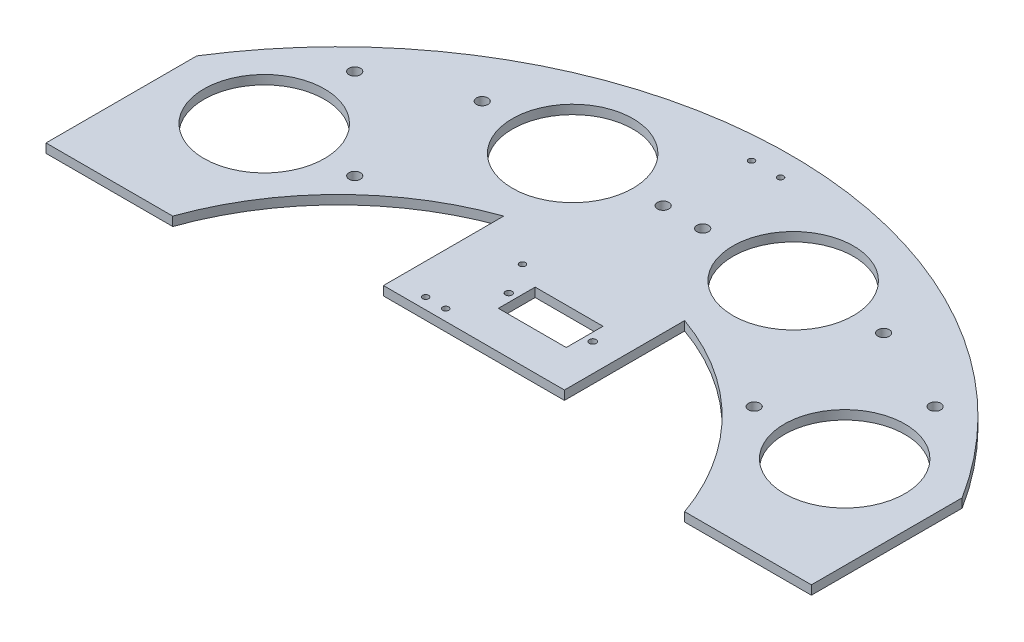
ISO-10303-21;
HEADER;
FILE_DESCRIPTION(('STEP AP214'),'2;1');
FILE_NAME('part.step','',(''),(''),'','','');
FILE_SCHEMA(('AUTOMOTIVE_DESIGN { 1 0 10303 214 1 1 1 1 }'));
ENDSEC;
DATA;
#1=APPLICATION_CONTEXT('core data for automotive mechanical design processes');
#2=APPLICATION_PROTOCOL_DEFINITION('international standard','automotive_design',2000,#1);
#3=PRODUCT_CONTEXT('',#1,'mechanical');
#4=PRODUCT('Part','Part','',(#3));
#5=PRODUCT_RELATED_PRODUCT_CATEGORY('part','',(#4));
#6=PRODUCT_DEFINITION_FORMATION('','',#4);
#7=PRODUCT_DEFINITION_CONTEXT('part definition',#1,'design');
#8=PRODUCT_DEFINITION('design','',#6,#7);
#9=PRODUCT_DEFINITION_SHAPE('','',#8);
#10=(LENGTH_UNIT() NAMED_UNIT(*) SI_UNIT(.MILLI.,.METRE.));
#11=(NAMED_UNIT(*) PLANE_ANGLE_UNIT() SI_UNIT($,.RADIAN.));
#12=(NAMED_UNIT(*) SI_UNIT($,.STERADIAN.) SOLID_ANGLE_UNIT());
#13=UNCERTAINTY_MEASURE_WITH_UNIT(LENGTH_MEASURE(1.E-05),#10,'distance_accuracy_value','');
#14=(GEOMETRIC_REPRESENTATION_CONTEXT(3) GLOBAL_UNCERTAINTY_ASSIGNED_CONTEXT((#13)) GLOBAL_UNIT_ASSIGNED_CONTEXT((#10,
#11,#12)) REPRESENTATION_CONTEXT('',''));
#15=CARTESIAN_POINT('',(0.,0.,0.));
#16=DIRECTION('',(0.,0.,1.));
#17=DIRECTION('',(1.,0.,0.));
#18=AXIS2_PLACEMENT_3D('',#15,#16,#17);
#19=CARTESIAN_POINT('',(126.885775404495,3.,0.));
#20=DIRECTION('',(-1.,0.,0.));
#21=DIRECTION('',(0.,0.,1.));
#22=AXIS2_PLACEMENT_3D('',#19,#20,#21);
#23=PLANE('',#22);
#24=DIRECTION('',(0.,0.,-1.));
#25=VECTOR('',#24,1.);
#26=CARTESIAN_POINT('',(126.885775404495,0.,0.));
#27=LINE('',#26,#25);
#28=CARTESIAN_POINT('',(126.885775404495,0.,16.7898324885886));
#29=VERTEX_POINT('',#28);
#30=CARTESIAN_POINT('',(126.885775404495,0.,-33.2101675114114));
#31=VERTEX_POINT('',#30);
#32=EDGE_CURVE('E274',#29,#31,#27,.T.);
#33=ORIENTED_EDGE('',*,*,#32,.T.);
#34=DIRECTION('',(0.,-1.,0.));
#35=VECTOR('',#34,1.);
#36=CARTESIAN_POINT('',(126.885775404495,3.,-33.2101675114114));
#37=LINE('',#36,#35);
#38=CARTESIAN_POINT('',(126.885775404495,3.,-33.2101675114114));
#39=VERTEX_POINT('',#38);
#40=EDGE_CURVE('E11',#39,#31,#37,.T.);
#41=ORIENTED_EDGE('',*,*,#40,.F.);
#42=DIRECTION('',(0.,0.,-1.));
#43=VECTOR('',#42,1.);
#44=CARTESIAN_POINT('',(126.885775404495,3.,0.));
#45=LINE('',#44,#43);
#46=CARTESIAN_POINT('',(126.885775404495,3.,16.7898324885886));
#47=VERTEX_POINT('',#46);
#48=EDGE_CURVE('E239',#47,#39,#45,.T.);
#49=ORIENTED_EDGE('',*,*,#48,.F.);
#50=DIRECTION('',(0.,-1.,0.));
#51=VECTOR('',#50,1.);
#52=CARTESIAN_POINT('',(126.885775404495,3.,16.7898324885886));
#53=LINE('',#52,#51);
#54=EDGE_CURVE('E262',#47,#29,#53,.T.);
#55=ORIENTED_EDGE('',*,*,#54,.T.);
#56=EDGE_LOOP('',(#33,#41,#49,#55));
#57=FACE_BOUND('',#56,.T.);
#58=ADVANCED_FACE('F39',(#57),#23,.F.);
#59=CARTESIAN_POINT('',(0.,3.,46.7898324885886));
#60=DIRECTION('',(0.,-1.,0.));
#61=DIRECTION('',(0.,0.,-1.));
#62=AXIS2_PLACEMENT_3D('',#59,#60,#61);
#63=CYLINDRICAL_SURFACE('',#62,150.);
#64=CARTESIAN_POINT('',(0.,0.,46.7898324885886));
#65=DIRECTION('',(0.,1.,0.));
#66=DIRECTION('',(0.,0.,1.));
#67=AXIS2_PLACEMENT_3D('',#64,#65,#66);
#68=CIRCLE('',#67,150.);
#69=CARTESIAN_POINT('',(-126.885775404495,0.,-33.2101675114114));
#70=VERTEX_POINT('',#69);
#71=EDGE_CURVE('E277',#31,#70,#68,.T.);
#72=ORIENTED_EDGE('',*,*,#71,.T.);
#73=DIRECTION('',(0.,-1.,0.));
#74=VECTOR('',#73,1.);
#75=CARTESIAN_POINT('',(-126.885775404495,3.,-33.2101675114114));
#76=LINE('',#75,#74);
#77=CARTESIAN_POINT('',(-126.885775404495,3.,-33.2101675114114));
#78=VERTEX_POINT('',#77);
#79=EDGE_CURVE('E47',#78,#70,#76,.T.);
#80=ORIENTED_EDGE('',*,*,#79,.F.);
#81=CARTESIAN_POINT('',(0.,3.,46.7898324885886));
#82=DIRECTION('',(0.,1.,0.));
#83=DIRECTION('',(0.,0.,1.));
#84=AXIS2_PLACEMENT_3D('',#81,#82,#83);
#85=CIRCLE('',#84,150.);
#86=EDGE_CURVE('E242',#39,#78,#85,.T.);
#87=ORIENTED_EDGE('',*,*,#86,.F.);
#88=ORIENTED_EDGE('',*,*,#40,.T.);
#89=EDGE_LOOP('',(#72,#80,#87,#88));
#90=FACE_BOUND('',#89,.T.);
#91=ADVANCED_FACE('F321',(#90),#63,.T.);
#92=CARTESIAN_POINT('',(-126.885775404495,3.,0.));
#93=DIRECTION('',(-1.,0.,0.));
#94=DIRECTION('',(0.,0.,1.));
#95=AXIS2_PLACEMENT_3D('',#92,#93,#94);
#96=PLANE('',#95);
#97=DIRECTION('',(0.,0.,-1.));
#98=VECTOR('',#97,1.);
#99=CARTESIAN_POINT('',(-126.885775404495,0.,0.));
#100=LINE('',#99,#98);
#101=CARTESIAN_POINT('',(-126.885775404495,0.,16.7898324885886));
#102=VERTEX_POINT('',#101);
#103=EDGE_CURVE('E280',#102,#70,#100,.T.);
#104=ORIENTED_EDGE('',*,*,#103,.F.);
#105=DIRECTION('',(0.,-1.,0.));
#106=VECTOR('',#105,1.);
#107=CARTESIAN_POINT('',(-126.885775404495,3.,16.7898324885886));
#108=LINE('',#107,#106);
#109=CARTESIAN_POINT('',(-126.885775404495,3.,16.7898324885886));
#110=VERTEX_POINT('',#109);
#111=EDGE_CURVE('E314',#110,#102,#108,.T.);
#112=ORIENTED_EDGE('',*,*,#111,.F.);
#113=DIRECTION('',(0.,0.,-1.));
#114=VECTOR('',#113,1.);
#115=CARTESIAN_POINT('',(-126.885775404495,3.,0.));
#116=LINE('',#115,#114);
#117=EDGE_CURVE('E244',#110,#78,#116,.T.);
#118=ORIENTED_EDGE('',*,*,#117,.T.);
#119=ORIENTED_EDGE('',*,*,#79,.T.);
#120=EDGE_LOOP('',(#104,#112,#118,#119));
#121=FACE_BOUND('',#120,.T.);
#122=ADVANCED_FACE('F318',(#121),#96,.T.);
#123=CARTESIAN_POINT('',(0.,3.,16.7898324885886));
#124=DIRECTION('',(0.,0.,-1.));
#125=DIRECTION('',(-1.,0.,0.));
#126=AXIS2_PLACEMENT_3D('',#123,#124,#125);
#127=PLANE('',#126);
#128=DIRECTION('',(1.,0.,0.));
#129=VECTOR('',#128,1.);
#130=CARTESIAN_POINT('',(0.,0.,16.7898324885886));
#131=LINE('',#130,#129);
#132=CARTESIAN_POINT('',(-84.8716884499019,0.,16.7898324885886));
#133=VERTEX_POINT('',#132);
#134=EDGE_CURVE('E283',#102,#133,#131,.T.);
#135=ORIENTED_EDGE('',*,*,#134,.T.);
#136=DIRECTION('',(0.,-1.,0.));
#137=VECTOR('',#136,1.);
#138=CARTESIAN_POINT('',(-84.8716884499019,3.,16.7898324885886));
#139=LINE('',#138,#137);
#140=CARTESIAN_POINT('',(-84.8716884499019,3.,16.7898324885886));
#141=VERTEX_POINT('',#140);
#142=EDGE_CURVE('E312',#141,#133,#139,.T.);
#143=ORIENTED_EDGE('',*,*,#142,.F.);
#144=DIRECTION('',(1.,0.,0.));
#145=VECTOR('',#144,1.);
#146=CARTESIAN_POINT('',(0.,3.,16.7898324885886));
#147=LINE('',#146,#145);
#148=EDGE_CURVE('E247',#110,#141,#147,.T.);
#149=ORIENTED_EDGE('',*,*,#148,.F.);
#150=ORIENTED_EDGE('',*,*,#111,.T.);
#151=EDGE_LOOP('',(#135,#143,#149,#150));
#152=FACE_BOUND('',#151,.T.);
#153=ADVANCED_FACE('F330',(#152),#127,.F.);
#154=CARTESIAN_POINT('',(0.,3.,46.7898324885886));
#155=DIRECTION('',(0.,-1.,0.));
#156=DIRECTION('',(0.,0.,-1.));
#157=AXIS2_PLACEMENT_3D('',#154,#155,#156);
#158=CYLINDRICAL_SURFACE('',#157,90.0177954647702);
#159=CARTESIAN_POINT('',(0.,0.,46.7898324885886));
#160=DIRECTION('',(0.,1.,0.));
#161=DIRECTION('',(0.,0.,1.));
#162=AXIS2_PLACEMENT_3D('',#159,#160,#161);
#163=CIRCLE('',#162,90.0177954647702);
#164=CARTESIAN_POINT('',(-30.,0.,-38.0818559613133));
#165=VERTEX_POINT('',#164);
#166=EDGE_CURVE('E286',#165,#133,#163,.T.);
#167=ORIENTED_EDGE('',*,*,#166,.F.);
#168=DIRECTION('',(0.,-1.,0.));
#169=VECTOR('',#168,1.);
#170=CARTESIAN_POINT('',(-30.,3.,-38.0818559613133));
#171=LINE('',#170,#169);
#172=CARTESIAN_POINT('',(-30.,3.,-38.0818559613133));
#173=VERTEX_POINT('',#172);
#174=EDGE_CURVE('E310',#173,#165,#171,.T.);
#175=ORIENTED_EDGE('',*,*,#174,.F.);
#176=CARTESIAN_POINT('',(0.,3.,46.7898324885886));
#177=DIRECTION('',(0.,1.,0.));
#178=DIRECTION('',(0.,0.,1.));
#179=AXIS2_PLACEMENT_3D('',#176,#177,#178);
#180=CIRCLE('',#179,90.0177954647702);
#181=EDGE_CURVE('E249',#173,#141,#180,.T.);
#182=ORIENTED_EDGE('',*,*,#181,.T.);
#183=ORIENTED_EDGE('',*,*,#142,.T.);
#184=EDGE_LOOP('',(#167,#175,#182,#183));
#185=FACE_BOUND('',#184,.T.);
#186=ADVANCED_FACE('F360',(#185),#158,.F.);
#187=CARTESIAN_POINT('',(-30.,3.,0.));
#188=DIRECTION('',(-1.,0.,0.));
#189=DIRECTION('',(0.,0.,1.));
#190=AXIS2_PLACEMENT_3D('',#187,#188,#189);
#191=PLANE('',#190);
#192=DIRECTION('',(0.,0.,-1.));
#193=VECTOR('',#192,1.);
#194=CARTESIAN_POINT('',(-30.,0.,0.));
#195=LINE('',#194,#193);
#196=CARTESIAN_POINT('',(-30.,0.,1.78983248858858));
#197=VERTEX_POINT('',#196);
#198=EDGE_CURVE('E289',#197,#165,#195,.T.);
#199=ORIENTED_EDGE('',*,*,#198,.F.);
#200=DIRECTION('',(0.,-1.,0.));
#201=VECTOR('',#200,1.);
#202=CARTESIAN_POINT('',(-30.,3.,1.78983248858858));
#203=LINE('',#202,#201);
#204=CARTESIAN_POINT('',(-30.,3.,1.78983248858858));
#205=VERTEX_POINT('',#204);
#206=EDGE_CURVE('E308',#205,#197,#203,.T.);
#207=ORIENTED_EDGE('',*,*,#206,.F.);
#208=DIRECTION('',(0.,0.,-1.));
#209=VECTOR('',#208,1.);
#210=CARTESIAN_POINT('',(-30.,3.,0.));
#211=LINE('',#210,#209);
#212=EDGE_CURVE('E252',#205,#173,#211,.T.);
#213=ORIENTED_EDGE('',*,*,#212,.T.);
#214=ORIENTED_EDGE('',*,*,#174,.T.);
#215=EDGE_LOOP('',(#199,#207,#213,#214));
#216=FACE_BOUND('',#215,.T.);
#217=ADVANCED_FACE('F356',(#216),#191,.T.);
#218=CARTESIAN_POINT('',(0.,3.,1.78983248858857));
#219=DIRECTION('',(0.,0.,-1.));
#220=DIRECTION('',(-1.,0.,0.));
#221=AXIS2_PLACEMENT_3D('',#218,#219,#220);
#222=PLANE('',#221);
#223=DIRECTION('',(1.,0.,0.));
#224=VECTOR('',#223,1.);
#225=CARTESIAN_POINT('',(0.,0.,1.78983248858857));
#226=LINE('',#225,#224);
#227=CARTESIAN_POINT('',(30.,0.,1.78983248858857));
#228=VERTEX_POINT('',#227);
#229=EDGE_CURVE('E293',#197,#228,#226,.T.);
#230=ORIENTED_EDGE('',*,*,#229,.T.);
#231=DIRECTION('',(0.,-1.,0.));
#232=VECTOR('',#231,1.);
#233=CARTESIAN_POINT('',(30.,3.,1.78983248858857));
#234=LINE('',#233,#232);
#235=CARTESIAN_POINT('',(30.,3.,1.78983248858857));
#236=VERTEX_POINT('',#235);
#237=EDGE_CURVE('E305',#236,#228,#234,.T.);
#238=ORIENTED_EDGE('',*,*,#237,.F.);
#239=DIRECTION('',(1.,0.,0.));
#240=VECTOR('',#239,1.);
#241=CARTESIAN_POINT('',(0.,3.,1.78983248858857));
#242=LINE('',#241,#240);
#243=EDGE_CURVE('E256',#205,#236,#242,.T.);
#244=ORIENTED_EDGE('',*,*,#243,.F.);
#245=ORIENTED_EDGE('',*,*,#206,.T.);
#246=EDGE_LOOP('',(#230,#238,#244,#245));
#247=FACE_BOUND('',#246,.T.);
#248=ADVANCED_FACE('F361',(#247),#222,.F.);
#249=CARTESIAN_POINT('',(30.,3.,0.));
#250=DIRECTION('',(-1.,0.,0.));
#251=DIRECTION('',(0.,0.,1.));
#252=AXIS2_PLACEMENT_3D('',#249,#250,#251);
#253=PLANE('',#252);
#254=DIRECTION('',(0.,0.,-1.));
#255=VECTOR('',#254,1.);
#256=CARTESIAN_POINT('',(30.,0.,0.));
#257=LINE('',#256,#255);
#258=CARTESIAN_POINT('',(30.,0.,-38.0818559613133));
#259=VERTEX_POINT('',#258);
#260=EDGE_CURVE('E295',#228,#259,#257,.T.);
#261=ORIENTED_EDGE('',*,*,#260,.T.);
#262=DIRECTION('',(0.,-1.,0.));
#263=VECTOR('',#262,1.);
#264=CARTESIAN_POINT('',(30.,3.,-38.0818559613133));
#265=LINE('',#264,#263);
#266=CARTESIAN_POINT('',(30.,3.,-38.0818559613133));
#267=VERTEX_POINT('',#266);
#268=EDGE_CURVE('E303',#267,#259,#265,.T.);
#269=ORIENTED_EDGE('',*,*,#268,.F.);
#270=DIRECTION('',(0.,0.,-1.));
#271=VECTOR('',#270,1.);
#272=CARTESIAN_POINT('',(30.,3.,0.));
#273=LINE('',#272,#271);
#274=EDGE_CURVE('E258',#236,#267,#273,.T.);
#275=ORIENTED_EDGE('',*,*,#274,.F.);
#276=ORIENTED_EDGE('',*,*,#237,.T.);
#277=EDGE_LOOP('',(#261,#269,#275,#276));
#278=FACE_BOUND('',#277,.T.);
#279=ADVANCED_FACE('F350',(#278),#253,.F.);
#280=CARTESIAN_POINT('',(84.8716884499019,0.,16.7898324885886));
#281=VERTEX_POINT('',#280);
#282=EDGE_CURVE('E290',#281,#259,#163,.T.);
#283=ORIENTED_EDGE('',*,*,#282,.F.);
#284=DIRECTION('',(0.,-1.,0.));
#285=VECTOR('',#284,1.);
#286=CARTESIAN_POINT('',(84.8716884499019,3.,16.7898324885886));
#287=LINE('',#286,#285);
#288=CARTESIAN_POINT('',(84.8716884499019,3.,16.7898324885886));
#289=VERTEX_POINT('',#288);
#290=EDGE_CURVE('E301',#289,#281,#287,.T.);
#291=ORIENTED_EDGE('',*,*,#290,.F.);
#292=EDGE_CURVE('E253',#289,#267,#180,.T.);
#293=ORIENTED_EDGE('',*,*,#292,.T.);
#294=ORIENTED_EDGE('',*,*,#268,.T.);
#295=EDGE_LOOP('',(#283,#291,#293,#294));
#296=FACE_BOUND('',#295,.T.);
#297=ADVANCED_FACE('F345',(#296),#158,.F.);
#298=CARTESIAN_POINT('',(36.5556268754658,3.,-67.5066510257423));
#299=DIRECTION('',(0.,-1.,0.));
#300=DIRECTION('',(0.,0.,-1.));
#301=AXIS2_PLACEMENT_3D('',#298,#299,#300);
#302=CYLINDRICAL_SURFACE('',#301,20.);
#303=CARTESIAN_POINT('',(36.5556268754658,3.,-67.5066510257423));
#304=DIRECTION('',(0.,1.,0.));
#305=DIRECTION('',(0.,0.,1.));
#306=AXIS2_PLACEMENT_3D('',#303,#304,#305);
#307=CIRCLE('',#306,20.);
#308=CARTESIAN_POINT('',(36.5556268754658,3.,-47.5066510257423));
#309=VERTEX_POINT('',#308);
#310=EDGE_CURVE('E236',#309,#309,#307,.F.);
#311=ORIENTED_EDGE('',*,*,#310,.F.);
#312=EDGE_LOOP('',(#311));
#313=FACE_BOUND('',#312,.T.);
#314=CARTESIAN_POINT('',(36.5556268754658,0.,-67.5066510257423));
#315=DIRECTION('',(0.,1.,0.));
#316=DIRECTION('',(0.,0.,1.));
#317=AXIS2_PLACEMENT_3D('',#314,#315,#316);
#318=CIRCLE('',#317,20.);
#319=CARTESIAN_POINT('',(36.5556268754658,0.,-47.5066510257423));
#320=VERTEX_POINT('',#319);
#321=EDGE_CURVE('E271',#320,#320,#318,.F.);
#322=ORIENTED_EDGE('',*,*,#321,.T.);
#323=EDGE_LOOP('',(#322));
#324=FACE_BOUND('',#323,.T.);
#325=ADVANCED_FACE('F378',(#313,#324),#302,.F.);
#326=CARTESIAN_POINT('',(-96.2238553059831,3.,-24.9107230884307));
#327=DIRECTION('',(0.,-1.,0.));
#328=DIRECTION('',(0.,0.,-1.));
#329=AXIS2_PLACEMENT_3D('',#326,#327,#328);
#330=CYLINDRICAL_SURFACE('',#329,20.);
#331=CARTESIAN_POINT('',(-96.2238553059831,3.,-24.9107230884307));
#332=DIRECTION('',(0.,1.,0.));
#333=DIRECTION('',(0.,0.,1.));
#334=AXIS2_PLACEMENT_3D('',#331,#332,#333);
#335=CIRCLE('',#334,20.);
#336=CARTESIAN_POINT('',(-96.2238553059831,3.,-4.91072308843064));
#337=VERTEX_POINT('',#336);
#338=EDGE_CURVE('E233',#337,#337,#335,.T.);
#339=ORIENTED_EDGE('',*,*,#338,.T.);
#340=EDGE_LOOP('',(#339));
#341=FACE_BOUND('',#340,.T.);
#342=CARTESIAN_POINT('',(-96.2238553059831,0.,-24.9107230884307));
#343=DIRECTION('',(0.,1.,0.));
#344=DIRECTION('',(0.,0.,1.));
#345=AXIS2_PLACEMENT_3D('',#342,#343,#344);
#346=CIRCLE('',#345,20.);
#347=CARTESIAN_POINT('',(-96.2238553059831,0.,-4.91072308843064));
#348=VERTEX_POINT('',#347);
#349=EDGE_CURVE('E268',#348,#348,#346,.T.);
#350=ORIENTED_EDGE('',*,*,#349,.F.);
#351=EDGE_LOOP('',(#350));
#352=FACE_BOUND('',#351,.T.);
#353=ADVANCED_FACE('F381',(#341,#352),#330,.F.);
#354=CARTESIAN_POINT('',(-36.5556268754658,3.,-67.5066510257423));
#355=DIRECTION('',(0.,-1.,0.));
#356=DIRECTION('',(0.,0.,-1.));
#357=AXIS2_PLACEMENT_3D('',#354,#355,#356);
#358=CYLINDRICAL_SURFACE('',#357,20.);
#359=CARTESIAN_POINT('',(-36.5556268754658,3.,-67.5066510257423));
#360=DIRECTION('',(0.,1.,0.));
#361=DIRECTION('',(0.,0.,1.));
#362=AXIS2_PLACEMENT_3D('',#359,#360,#361);
#363=CIRCLE('',#362,20.);
#364=CARTESIAN_POINT('',(-36.5556268754658,3.,-47.5066510257423));
#365=VERTEX_POINT('',#364);
#366=EDGE_CURVE('E229',#365,#365,#363,.T.);
#367=ORIENTED_EDGE('',*,*,#366,.T.);
#368=EDGE_LOOP('',(#367));
#369=FACE_BOUND('',#368,.T.);
#370=CARTESIAN_POINT('',(-36.5556268754658,0.,-67.5066510257423));
#371=DIRECTION('',(0.,1.,0.));
#372=DIRECTION('',(0.,0.,1.));
#373=AXIS2_PLACEMENT_3D('',#370,#371,#372);
#374=CIRCLE('',#373,20.);
#375=CARTESIAN_POINT('',(-36.5556268754658,0.,-47.5066510257423));
#376=VERTEX_POINT('',#375);
#377=EDGE_CURVE('E265',#376,#376,#374,.T.);
#378=ORIENTED_EDGE('',*,*,#377,.F.);
#379=EDGE_LOOP('',(#378));
#380=FACE_BOUND('',#379,.T.);
#381=ADVANCED_FACE('F384',(#369,#380),#358,.F.);
#382=CARTESIAN_POINT('',(96.2238553059831,3.,-24.9107230884307));
#383=DIRECTION('',(0.,-1.,0.));
#384=DIRECTION('',(0.,0.,-1.));
#385=AXIS2_PLACEMENT_3D('',#382,#383,#384);
#386=CYLINDRICAL_SURFACE('',#385,20.);
#387=CARTESIAN_POINT('',(96.2238553059831,3.,-24.9107230884307));
#388=DIRECTION('',(0.,1.,0.));
#389=DIRECTION('',(0.,0.,1.));
#390=AXIS2_PLACEMENT_3D('',#387,#388,#389);
#391=CIRCLE('',#390,20.);
#392=CARTESIAN_POINT('',(96.2238553059831,3.,-4.91072308843069));
#393=VERTEX_POINT('',#392);
#394=EDGE_CURVE('E226',#393,#393,#391,.F.);
#395=ORIENTED_EDGE('',*,*,#394,.F.);
#396=EDGE_LOOP('',(#395));
#397=FACE_BOUND('',#396,.T.);
#398=CARTESIAN_POINT('',(96.2238553059831,0.,-24.9107230884307));
#399=DIRECTION('',(0.,1.,0.));
#400=DIRECTION('',(0.,0.,1.));
#401=AXIS2_PLACEMENT_3D('',#398,#399,#400);
#402=CIRCLE('',#401,20.);
#403=CARTESIAN_POINT('',(96.2238553059831,0.,-4.91072308843069));
#404=VERTEX_POINT('',#403);
#405=EDGE_CURVE('E225',#404,#404,#402,.F.);
#406=ORIENTED_EDGE('',*,*,#405,.T.);
#407=EDGE_LOOP('',(#406));
#408=FACE_BOUND('',#407,.T.);
#409=ADVANCED_FACE('F41',(#397,#408),#386,.F.);
#410=CARTESIAN_POINT('',(0.,3.,16.7898324885886));
#411=DIRECTION('',(0.,0.,-1.));
#412=DIRECTION('',(-1.,0.,0.));
#413=AXIS2_PLACEMENT_3D('',#410,#411,#412);
#414=PLANE('',#413);
#415=DIRECTION('',(1.,0.,0.));
#416=VECTOR('',#415,1.);
#417=CARTESIAN_POINT('',(0.,0.,16.7898324885886));
#418=LINE('',#417,#416);
#419=EDGE_CURVE('E230',#281,#29,#418,.T.);
#420=ORIENTED_EDGE('',*,*,#419,.T.);
#421=ORIENTED_EDGE('',*,*,#54,.F.);
#422=DIRECTION('',(1.,0.,0.));
#423=VECTOR('',#422,1.);
#424=CARTESIAN_POINT('',(0.,3.,16.7898324885886));
#425=LINE('',#424,#423);
#426=EDGE_CURVE('E260',#289,#47,#425,.T.);
#427=ORIENTED_EDGE('',*,*,#426,.F.);
#428=ORIENTED_EDGE('',*,*,#290,.T.);
#429=EDGE_LOOP('',(#420,#421,#427,#428));
#430=FACE_BOUND('',#429,.T.);
#431=ADVANCED_FACE('F391',(#430),#414,.F.);
#432=CARTESIAN_POINT('',(0.,3.,0.));
#433=DIRECTION('',(0.,1.,0.));
#434=DIRECTION('',(0.,0.,1.));
#435=AXIS2_PLACEMENT_3D('',#432,#433,#434);
#436=PLANE('',#435);
#437=CARTESIAN_POINT('',(-19.7020798031692,3.,-1.91072308843045));
#438=DIRECTION('',(0.,-1.,0.));
#439=DIRECTION('',(0.,0.,-1.));
#440=AXIS2_PLACEMENT_3D('',#437,#438,#439);
#441=CIRCLE('',#440,1.);
#442=CARTESIAN_POINT('',(-19.7020798031692,3.,-2.91072308843045));
#443=VERTEX_POINT('',#442);
#444=EDGE_CURVE('E723',#443,#443,#441,.T.);
#445=ORIENTED_EDGE('',*,*,#444,.T.);
#446=EDGE_LOOP('',(#445));
#447=FACE_BOUND('',#446,.T.);
#448=CARTESIAN_POINT('',(-13.0536928846308,3.,-27.360397158154));
#449=DIRECTION('',(0.,-1.,0.));
#450=DIRECTION('',(0.,0.,-1.));
#451=AXIS2_PLACEMENT_3D('',#448,#449,#450);
#452=CIRCLE('',#451,1.);
#453=CARTESIAN_POINT('',(-13.0536928846308,3.,-28.360397158154));
#454=VERTEX_POINT('',#453);
#455=EDGE_CURVE('E726',#454,#454,#452,.T.);
#456=ORIENTED_EDGE('',*,*,#455,.T.);
#457=EDGE_LOOP('',(#456));
#458=FACE_BOUND('',#457,.T.);
#459=CARTESIAN_POINT('',(-4.80495675321821,3.,-95.0640967364949));
#460=DIRECTION('',(0.,-1.,0.));
#461=DIRECTION('',(0.,0.,-1.));
#462=AXIS2_PLACEMENT_3D('',#459,#460,#461);
#463=CIRCLE('',#462,1.);
#464=CARTESIAN_POINT('',(-4.80495675321821,3.,-96.0640967364949));
#465=VERTEX_POINT('',#464);
#466=EDGE_CURVE('E737',#465,#465,#463,.T.);
#467=ORIENTED_EDGE('',*,*,#466,.T.);
#468=EDGE_LOOP('',(#467));
#469=FACE_BOUND('',#468,.T.);
#470=CARTESIAN_POINT('',(4.804956753218,3.,-95.0640967364949));
#471=DIRECTION('',(0.,-1.,0.));
#472=DIRECTION('',(0.,0.,-1.));
#473=AXIS2_PLACEMENT_3D('',#470,#471,#472);
#474=CIRCLE('',#473,1.);
#475=CARTESIAN_POINT('',(4.804956753218,3.,-96.0640967364949));
#476=VERTEX_POINT('',#475);
#477=EDGE_CURVE('E743',#476,#476,#474,.T.);
#478=ORIENTED_EDGE('',*,*,#477,.T.);
#479=EDGE_LOOP('',(#478));
#480=FACE_BOUND('',#479,.T.);
#481=CARTESIAN_POINT('',(-7.05000000000014,3.,-16.8101675114101));
#482=DIRECTION('',(0.,-1.,0.));
#483=DIRECTION('',(0.,0.,-1.));
#484=AXIS2_PLACEMENT_3D('',#481,#482,#483);
#485=CIRCLE('',#484,1.10000000000342);
#486=CARTESIAN_POINT('',(-7.05000000000014,3.,-17.9101675114136));
#487=VERTEX_POINT('',#486);
#488=EDGE_CURVE('E749',#487,#487,#485,.T.);
#489=ORIENTED_EDGE('',*,*,#488,.T.);
#490=EDGE_LOOP('',(#489));
#491=FACE_BOUND('',#490,.T.);
#492=CARTESIAN_POINT('',(20.7547369033658,3.,-16.8322180336056));
#493=DIRECTION('',(0.,-1.,0.));
#494=DIRECTION('',(0.,0.,-1.));
#495=AXIS2_PLACEMENT_3D('',#492,#493,#494);
#496=CIRCLE('',#495,1.12255357582713);
#497=CARTESIAN_POINT('',(20.7547369033658,3.,-17.9547716094327));
#498=VERTEX_POINT('',#497);
#499=EDGE_CURVE('E819',#498,#498,#496,.T.);
#500=ORIENTED_EDGE('',*,*,#499,.T.);
#501=EDGE_LOOP('',(#500));
#502=FACE_BOUND('',#501,.T.);
#503=CARTESIAN_POINT('',(-13.0536928846308,3.,-1.91072308843045));
#504=DIRECTION('',(0.,-1.,0.));
#505=DIRECTION('',(0.,0.,-1.));
#506=AXIS2_PLACEMENT_3D('',#503,#504,#505);
#507=CIRCLE('',#506,1.);
#508=CARTESIAN_POINT('',(-13.0536928846308,3.,-2.91072308843045));
#509=VERTEX_POINT('',#508);
#510=EDGE_CURVE('E750',#509,#509,#507,.T.);
#511=ORIENTED_EDGE('',*,*,#510,.T.);
#512=EDGE_LOOP('',(#511));
#513=FACE_BOUND('',#512,.T.);
#514=DIRECTION('',(-1.,0.,0.));
#515=VECTOR('',#514,1.);
#516=CARTESIAN_POINT('',(18.0999999999999,3.,-10.7101675114102));
#517=LINE('',#516,#515);
#518=CARTESIAN_POINT('',(18.0999999999999,3.,-10.7101675114102));
#519=VERTEX_POINT('',#518);
#520=CARTESIAN_POINT('',(-4.40000000000014,3.,-10.7101675114102));
#521=VERTEX_POINT('',#520);
#522=EDGE_CURVE('E154',#519,#521,#517,.T.);
#523=ORIENTED_EDGE('',*,*,#522,.T.);
#524=DIRECTION('',(0.,0.,-1.));
#525=VECTOR('',#524,1.);
#526=CARTESIAN_POINT('',(-4.40000000000014,3.,-10.7101675114102));
#527=LINE('',#526,#525);
#528=CARTESIAN_POINT('',(-4.40000000000014,3.,-22.9101675114101));
#529=VERTEX_POINT('',#528);
#530=EDGE_CURVE('E141',#521,#529,#527,.T.);
#531=ORIENTED_EDGE('',*,*,#530,.T.);
#532=DIRECTION('',(1.,0.,0.));
#533=VECTOR('',#532,1.);
#534=CARTESIAN_POINT('',(-4.40000000000014,3.,-22.9101675114101));
#535=LINE('',#534,#533);
#536=CARTESIAN_POINT('',(18.0999999999999,3.,-22.9101675114101));
#537=VERTEX_POINT('',#536);
#538=EDGE_CURVE('E172',#529,#537,#535,.T.);
#539=ORIENTED_EDGE('',*,*,#538,.T.);
#540=DIRECTION('',(0.,0.,1.));
#541=VECTOR('',#540,1.);
#542=CARTESIAN_POINT('',(18.0999999999999,3.,-22.9101675114101));
#543=LINE('',#542,#541);
#544=EDGE_CURVE('E162',#537,#519,#543,.T.);
#545=ORIENTED_EDGE('',*,*,#544,.T.);
#546=EDGE_LOOP('',(#523,#531,#539,#545));
#547=FACE_BOUND('',#546,.T.);
#548=CARTESIAN_POINT('',(-66.2238553059831,3.,-24.9107230884307));
#549=DIRECTION('',(0.,1.,0.));
#550=DIRECTION('',(0.,0.,1.));
#551=AXIS2_PLACEMENT_3D('',#548,#549,#550);
#552=CIRCLE('',#551,1.89865);
#553=CARTESIAN_POINT('',(-66.2238553059831,3.,-23.0120730884307));
#554=VERTEX_POINT('',#553);
#555=EDGE_CURVE('E177',#554,#554,#552,.T.);
#556=ORIENTED_EDGE('',*,*,#555,.F.);
#557=EDGE_LOOP('',(#556));
#558=FACE_BOUND('',#557,.T.);
#559=CARTESIAN_POINT('',(-96.2238553059831,3.,-54.9107230884307));
#560=DIRECTION('',(0.,1.,0.));
#561=DIRECTION('',(0.,0.,1.));
#562=AXIS2_PLACEMENT_3D('',#559,#560,#561);
#563=CIRCLE('',#562,1.89865);
#564=CARTESIAN_POINT('',(-96.2238553059831,3.,-53.0120730884307));
#565=VERTEX_POINT('',#564);
#566=EDGE_CURVE('E183',#565,#565,#563,.T.);
#567=ORIENTED_EDGE('',*,*,#566,.F.);
#568=EDGE_LOOP('',(#567));
#569=FACE_BOUND('',#568,.T.);
#570=CARTESIAN_POINT('',(-66.5556268754658,3.,-67.5066510257423));
#571=DIRECTION('',(0.,1.,0.));
#572=DIRECTION('',(0.,0.,1.));
#573=AXIS2_PLACEMENT_3D('',#570,#571,#572);
#574=CIRCLE('',#573,1.89865);
#575=CARTESIAN_POINT('',(-66.5556268754658,3.,-65.6080010257423));
#576=VERTEX_POINT('',#575);
#577=EDGE_CURVE('E189',#576,#576,#574,.T.);
#578=ORIENTED_EDGE('',*,*,#577,.F.);
#579=EDGE_LOOP('',(#578));
#580=FACE_BOUND('',#579,.T.);
#581=CARTESIAN_POINT('',(-6.55562687546583,3.,-67.5066510257423));
#582=DIRECTION('',(0.,1.,0.));
#583=DIRECTION('',(0.,0.,1.));
#584=AXIS2_PLACEMENT_3D('',#581,#582,#583);
#585=CIRCLE('',#584,1.89865);
#586=CARTESIAN_POINT('',(-6.55562687546583,3.,-65.6080010257423));
#587=VERTEX_POINT('',#586);
#588=EDGE_CURVE('E195',#587,#587,#585,.T.);
#589=ORIENTED_EDGE('',*,*,#588,.F.);
#590=EDGE_LOOP('',(#589));
#591=FACE_BOUND('',#590,.T.);
#592=CARTESIAN_POINT('',(6.55562687546583,3.,-67.5066510257423));
#593=DIRECTION('',(0.,1.,0.));
#594=DIRECTION('',(0.,0.,1.));
#595=AXIS2_PLACEMENT_3D('',#592,#593,#594);
#596=CIRCLE('',#595,1.89865);
#597=CARTESIAN_POINT('',(6.55562687546583,3.,-65.6080010257423));
#598=VERTEX_POINT('',#597);
#599=EDGE_CURVE('E201',#598,#598,#596,.T.);
#600=ORIENTED_EDGE('',*,*,#599,.F.);
#601=EDGE_LOOP('',(#600));
#602=FACE_BOUND('',#601,.T.);
#603=CARTESIAN_POINT('',(66.5556268754658,3.,-67.5066510257423));
#604=DIRECTION('',(0.,1.,0.));
#605=DIRECTION('',(0.,0.,1.));
#606=AXIS2_PLACEMENT_3D('',#603,#604,#605);
#607=CIRCLE('',#606,1.89865);
#608=CARTESIAN_POINT('',(66.5556268754658,3.,-65.6080010257423));
#609=VERTEX_POINT('',#608);
#610=EDGE_CURVE('E207',#609,#609,#607,.T.);
#611=ORIENTED_EDGE('',*,*,#610,.F.);
#612=EDGE_LOOP('',(#611));
#613=FACE_BOUND('',#612,.T.);
#614=CARTESIAN_POINT('',(96.2238553059831,3.,-54.9107230884307));
#615=DIRECTION('',(0.,1.,0.));
#616=DIRECTION('',(0.,0.,1.));
#617=AXIS2_PLACEMENT_3D('',#614,#615,#616);
#618=CIRCLE('',#617,1.89865);
#619=CARTESIAN_POINT('',(96.2238553059831,3.,-53.0120730884307));
#620=VERTEX_POINT('',#619);
#621=EDGE_CURVE('E213',#620,#620,#618,.T.);
#622=ORIENTED_EDGE('',*,*,#621,.F.);
#623=EDGE_LOOP('',(#622));
#624=FACE_BOUND('',#623,.T.);
#625=CARTESIAN_POINT('',(66.2238553059831,3.,-24.9107230884307));
#626=DIRECTION('',(0.,1.,0.));
#627=DIRECTION('',(0.,0.,1.));
#628=AXIS2_PLACEMENT_3D('',#625,#626,#627);
#629=CIRCLE('',#628,1.89865);
#630=CARTESIAN_POINT('',(66.2238553059831,3.,-23.0120730884307));
#631=VERTEX_POINT('',#630);
#632=EDGE_CURVE('E219',#631,#631,#629,.T.);
#633=ORIENTED_EDGE('',*,*,#632,.F.);
#634=EDGE_LOOP('',(#633));
#635=FACE_BOUND('',#634,.T.);
#636=ORIENTED_EDGE('',*,*,#394,.T.);
#637=EDGE_LOOP('',(#636));
#638=FACE_BOUND('',#637,.T.);
#639=ORIENTED_EDGE('',*,*,#366,.F.);
#640=EDGE_LOOP('',(#639));
#641=FACE_BOUND('',#640,.T.);
#642=ORIENTED_EDGE('',*,*,#338,.F.);
#643=EDGE_LOOP('',(#642));
#644=FACE_BOUND('',#643,.T.);
#645=ORIENTED_EDGE('',*,*,#310,.T.);
#646=EDGE_LOOP('',(#645));
#647=FACE_BOUND('',#646,.T.);
#648=ORIENTED_EDGE('',*,*,#48,.T.);
#649=ORIENTED_EDGE('',*,*,#86,.T.);
#650=ORIENTED_EDGE('',*,*,#117,.F.);
#651=ORIENTED_EDGE('',*,*,#148,.T.);
#652=ORIENTED_EDGE('',*,*,#181,.F.);
#653=ORIENTED_EDGE('',*,*,#212,.F.);
#654=ORIENTED_EDGE('',*,*,#243,.T.);
#655=ORIENTED_EDGE('',*,*,#274,.T.);
#656=ORIENTED_EDGE('',*,*,#292,.F.);
#657=ORIENTED_EDGE('',*,*,#426,.T.);
#658=EDGE_LOOP('',(#648,#649,#650,#651,#652,#653,#654,#655,#656,#657));
#659=FACE_BOUND('',#658,.T.);
#660=ADVANCED_FACE('F160',(#447,#458,#469,#480,#491,#502,#513,#547,#558,#569,#580,#591,#602,
#613,#624,#635,#638,#641,#644,#647,#659),#436,.T.);
#661=CARTESIAN_POINT('',(0.,0.,0.));
#662=DIRECTION('',(0.,1.,0.));
#663=DIRECTION('',(0.,0.,1.));
#664=AXIS2_PLACEMENT_3D('',#661,#662,#663);
#665=PLANE('',#664);
#666=CARTESIAN_POINT('',(-19.7020798031692,0.,-1.91072308843045));
#667=DIRECTION('',(0.,-1.,0.));
#668=DIRECTION('',(0.,0.,-1.));
#669=AXIS2_PLACEMENT_3D('',#666,#667,#668);
#670=CIRCLE('',#669,1.);
#671=CARTESIAN_POINT('',(-19.7020798031692,0.,-2.91072308843045));
#672=VERTEX_POINT('',#671);
#673=EDGE_CURVE('E725',#672,#672,#670,.T.);
#674=ORIENTED_EDGE('',*,*,#673,.F.);
#675=EDGE_LOOP('',(#674));
#676=FACE_BOUND('',#675,.T.);
#677=CARTESIAN_POINT('',(-13.0536928846308,0.,-27.360397158154));
#678=DIRECTION('',(0.,-1.,0.));
#679=DIRECTION('',(0.,0.,-1.));
#680=AXIS2_PLACEMENT_3D('',#677,#678,#679);
#681=CIRCLE('',#680,1.);
#682=CARTESIAN_POINT('',(-13.0536928846308,0.,-28.360397158154));
#683=VERTEX_POINT('',#682);
#684=EDGE_CURVE('E731',#683,#683,#681,.T.);
#685=ORIENTED_EDGE('',*,*,#684,.F.);
#686=EDGE_LOOP('',(#685));
#687=FACE_BOUND('',#686,.T.);
#688=CARTESIAN_POINT('',(-4.80495675321821,0.,-95.0640967364949));
#689=DIRECTION('',(0.,-1.,0.));
#690=DIRECTION('',(0.,0.,-1.));
#691=AXIS2_PLACEMENT_3D('',#688,#689,#690);
#692=CIRCLE('',#691,1.);
#693=CARTESIAN_POINT('',(-4.80495675321821,0.,-96.0640967364949));
#694=VERTEX_POINT('',#693);
#695=EDGE_CURVE('E740',#694,#694,#692,.T.);
#696=ORIENTED_EDGE('',*,*,#695,.F.);
#697=EDGE_LOOP('',(#696));
#698=FACE_BOUND('',#697,.T.);
#699=CARTESIAN_POINT('',(4.804956753218,0.,-95.0640967364949));
#700=DIRECTION('',(0.,-1.,0.));
#701=DIRECTION('',(0.,0.,-1.));
#702=AXIS2_PLACEMENT_3D('',#699,#700,#701);
#703=CIRCLE('',#702,1.);
#704=CARTESIAN_POINT('',(4.804956753218,0.,-96.0640967364949));
#705=VERTEX_POINT('',#704);
#706=EDGE_CURVE('E746',#705,#705,#703,.T.);
#707=ORIENTED_EDGE('',*,*,#706,.F.);
#708=EDGE_LOOP('',(#707));
#709=FACE_BOUND('',#708,.T.);
#710=CARTESIAN_POINT('',(-7.05000000000014,0.,-16.8101675114101));
#711=DIRECTION('',(0.,-1.,0.));
#712=DIRECTION('',(0.,0.,-1.));
#713=AXIS2_PLACEMENT_3D('',#710,#711,#712);
#714=CIRCLE('',#713,1.10000000000342);
#715=CARTESIAN_POINT('',(-7.05000000000014,0.,-17.9101675114136));
#716=VERTEX_POINT('',#715);
#717=EDGE_CURVE('E814',#716,#716,#714,.T.);
#718=ORIENTED_EDGE('',*,*,#717,.F.);
#719=EDGE_LOOP('',(#718));
#720=FACE_BOUND('',#719,.T.);
#721=CARTESIAN_POINT('',(20.7547369033658,0.,-16.8322180336056));
#722=DIRECTION('',(0.,-1.,0.));
#723=DIRECTION('',(0.,0.,-1.));
#724=AXIS2_PLACEMENT_3D('',#721,#722,#723);
#725=CIRCLE('',#724,1.12255357582713);
#726=CARTESIAN_POINT('',(20.7547369033658,0.,-17.9547716094327));
#727=VERTEX_POINT('',#726);
#728=EDGE_CURVE('E823',#727,#727,#725,.T.);
#729=ORIENTED_EDGE('',*,*,#728,.F.);
#730=EDGE_LOOP('',(#729));
#731=FACE_BOUND('',#730,.T.);
#732=CARTESIAN_POINT('',(-13.0536928846308,0.,-1.91072308843045));
#733=DIRECTION('',(0.,-1.,0.));
#734=DIRECTION('',(0.,0.,-1.));
#735=AXIS2_PLACEMENT_3D('',#732,#733,#734);
#736=CIRCLE('',#735,1.);
#737=CARTESIAN_POINT('',(-13.0536928846308,0.,-2.91072308843045));
#738=VERTEX_POINT('',#737);
#739=EDGE_CURVE('E728',#738,#738,#736,.T.);
#740=ORIENTED_EDGE('',*,*,#739,.F.);
#741=EDGE_LOOP('',(#740));
#742=FACE_BOUND('',#741,.T.);
#743=DIRECTION('',(0.,0.,-1.));
#744=VECTOR('',#743,1.);
#745=CARTESIAN_POINT('',(-4.40000000000014,0.,-10.7101675114102));
#746=LINE('',#745,#744);
#747=CARTESIAN_POINT('',(-4.40000000000014,0.,-10.7101675114102));
#748=VERTEX_POINT('',#747);
#749=CARTESIAN_POINT('',(-4.40000000000014,0.,-22.9101675114101));
#750=VERTEX_POINT('',#749);
#751=EDGE_CURVE('E164',#748,#750,#746,.T.);
#752=ORIENTED_EDGE('',*,*,#751,.F.);
#753=DIRECTION('',(-1.,0.,0.));
#754=VECTOR('',#753,1.);
#755=CARTESIAN_POINT('',(18.0999999999999,0.,-10.7101675114102));
#756=LINE('',#755,#754);
#757=CARTESIAN_POINT('',(18.0999999999999,0.,-10.7101675114102));
#758=VERTEX_POINT('',#757);
#759=EDGE_CURVE('E157',#758,#748,#756,.T.);
#760=ORIENTED_EDGE('',*,*,#759,.F.);
#761=DIRECTION('',(0.,0.,1.));
#762=VECTOR('',#761,1.);
#763=CARTESIAN_POINT('',(18.0999999999999,0.,-22.9101675114101));
#764=LINE('',#763,#762);
#765=CARTESIAN_POINT('',(18.0999999999999,0.,-22.9101675114101));
#766=VERTEX_POINT('',#765);
#767=EDGE_CURVE('E168',#766,#758,#764,.T.);
#768=ORIENTED_EDGE('',*,*,#767,.F.);
#769=DIRECTION('',(1.,0.,0.));
#770=VECTOR('',#769,1.);
#771=CARTESIAN_POINT('',(-4.40000000000014,0.,-22.9101675114101));
#772=LINE('',#771,#770);
#773=EDGE_CURVE('E62',#750,#766,#772,.T.);
#774=ORIENTED_EDGE('',*,*,#773,.F.);
#775=EDGE_LOOP('',(#752,#760,#768,#774));
#776=FACE_BOUND('',#775,.T.);
#777=CARTESIAN_POINT('',(-66.2238553059831,0.,-24.9107230884307));
#778=DIRECTION('',(0.,1.,0.));
#779=DIRECTION('',(0.,0.,1.));
#780=AXIS2_PLACEMENT_3D('',#777,#778,#779);
#781=CIRCLE('',#780,1.89865);
#782=CARTESIAN_POINT('',(-66.2238553059831,0.,-23.0120730884307));
#783=VERTEX_POINT('',#782);
#784=EDGE_CURVE('E180',#783,#783,#781,.T.);
#785=ORIENTED_EDGE('',*,*,#784,.T.);
#786=EDGE_LOOP('',(#785));
#787=FACE_BOUND('',#786,.T.);
#788=CARTESIAN_POINT('',(-96.2238553059831,0.,-54.9107230884307));
#789=DIRECTION('',(0.,1.,0.));
#790=DIRECTION('',(0.,0.,1.));
#791=AXIS2_PLACEMENT_3D('',#788,#789,#790);
#792=CIRCLE('',#791,1.89865);
#793=CARTESIAN_POINT('',(-96.2238553059831,0.,-53.0120730884307));
#794=VERTEX_POINT('',#793);
#795=EDGE_CURVE('E186',#794,#794,#792,.T.);
#796=ORIENTED_EDGE('',*,*,#795,.T.);
#797=EDGE_LOOP('',(#796));
#798=FACE_BOUND('',#797,.T.);
#799=CARTESIAN_POINT('',(-66.5556268754658,0.,-67.5066510257423));
#800=DIRECTION('',(0.,1.,0.));
#801=DIRECTION('',(0.,0.,1.));
#802=AXIS2_PLACEMENT_3D('',#799,#800,#801);
#803=CIRCLE('',#802,1.89865);
#804=CARTESIAN_POINT('',(-66.5556268754658,0.,-65.6080010257423));
#805=VERTEX_POINT('',#804);
#806=EDGE_CURVE('E192',#805,#805,#803,.T.);
#807=ORIENTED_EDGE('',*,*,#806,.T.);
#808=EDGE_LOOP('',(#807));
#809=FACE_BOUND('',#808,.T.);
#810=CARTESIAN_POINT('',(-6.55562687546583,0.,-67.5066510257423));
#811=DIRECTION('',(0.,1.,0.));
#812=DIRECTION('',(0.,0.,1.));
#813=AXIS2_PLACEMENT_3D('',#810,#811,#812);
#814=CIRCLE('',#813,1.89865);
#815=CARTESIAN_POINT('',(-6.55562687546583,0.,-65.6080010257423));
#816=VERTEX_POINT('',#815);
#817=EDGE_CURVE('E198',#816,#816,#814,.T.);
#818=ORIENTED_EDGE('',*,*,#817,.T.);
#819=EDGE_LOOP('',(#818));
#820=FACE_BOUND('',#819,.T.);
#821=CARTESIAN_POINT('',(6.55562687546583,0.,-67.5066510257423));
#822=DIRECTION('',(0.,1.,0.));
#823=DIRECTION('',(0.,0.,1.));
#824=AXIS2_PLACEMENT_3D('',#821,#822,#823);
#825=CIRCLE('',#824,1.89864999999999);
#826=CARTESIAN_POINT('',(6.55562687546583,0.,-65.6080010257424));
#827=VERTEX_POINT('',#826);
#828=EDGE_CURVE('E204',#827,#827,#825,.T.);
#829=ORIENTED_EDGE('',*,*,#828,.T.);
#830=EDGE_LOOP('',(#829));
#831=FACE_BOUND('',#830,.T.);
#832=CARTESIAN_POINT('',(66.5556268754658,0.,-67.5066510257423));
#833=DIRECTION('',(0.,1.,0.));
#834=DIRECTION('',(0.,0.,1.));
#835=AXIS2_PLACEMENT_3D('',#832,#833,#834);
#836=CIRCLE('',#835,1.89865);
#837=CARTESIAN_POINT('',(66.5556268754658,0.,-65.6080010257423));
#838=VERTEX_POINT('',#837);
#839=EDGE_CURVE('E210',#838,#838,#836,.T.);
#840=ORIENTED_EDGE('',*,*,#839,.T.);
#841=EDGE_LOOP('',(#840));
#842=FACE_BOUND('',#841,.T.);
#843=CARTESIAN_POINT('',(96.2238553059831,0.,-54.9107230884307));
#844=DIRECTION('',(0.,1.,0.));
#845=DIRECTION('',(0.,0.,1.));
#846=AXIS2_PLACEMENT_3D('',#843,#844,#845);
#847=CIRCLE('',#846,1.89865);
#848=CARTESIAN_POINT('',(96.2238553059831,0.,-53.0120730884307));
#849=VERTEX_POINT('',#848);
#850=EDGE_CURVE('E216',#849,#849,#847,.T.);
#851=ORIENTED_EDGE('',*,*,#850,.T.);
#852=EDGE_LOOP('',(#851));
#853=FACE_BOUND('',#852,.T.);
#854=CARTESIAN_POINT('',(66.2238553059831,0.,-24.9107230884307));
#855=DIRECTION('',(0.,1.,0.));
#856=DIRECTION('',(0.,0.,1.));
#857=AXIS2_PLACEMENT_3D('',#854,#855,#856);
#858=CIRCLE('',#857,1.89865);
#859=CARTESIAN_POINT('',(66.2238553059831,0.,-23.0120730884307));
#860=VERTEX_POINT('',#859);
#861=EDGE_CURVE('E222',#860,#860,#858,.T.);
#862=ORIENTED_EDGE('',*,*,#861,.T.);
#863=EDGE_LOOP('',(#862));
#864=FACE_BOUND('',#863,.T.);
#865=ORIENTED_EDGE('',*,*,#405,.F.);
#866=EDGE_LOOP('',(#865));
#867=FACE_BOUND('',#866,.T.);
#868=ORIENTED_EDGE('',*,*,#377,.T.);
#869=EDGE_LOOP('',(#868));
#870=FACE_BOUND('',#869,.T.);
#871=ORIENTED_EDGE('',*,*,#349,.T.);
#872=EDGE_LOOP('',(#871));
#873=FACE_BOUND('',#872,.T.);
#874=ORIENTED_EDGE('',*,*,#321,.F.);
#875=EDGE_LOOP('',(#874));
#876=FACE_BOUND('',#875,.T.);
#877=ORIENTED_EDGE('',*,*,#32,.F.);
#878=ORIENTED_EDGE('',*,*,#419,.F.);
#879=ORIENTED_EDGE('',*,*,#282,.T.);
#880=ORIENTED_EDGE('',*,*,#260,.F.);
#881=ORIENTED_EDGE('',*,*,#229,.F.);
#882=ORIENTED_EDGE('',*,*,#198,.T.);
#883=ORIENTED_EDGE('',*,*,#166,.T.);
#884=ORIENTED_EDGE('',*,*,#134,.F.);
#885=ORIENTED_EDGE('',*,*,#103,.T.);
#886=ORIENTED_EDGE('',*,*,#71,.F.);
#887=EDGE_LOOP('',(#877,#878,#879,#880,#881,#882,#883,#884,#885,#886));
#888=FACE_BOUND('',#887,.T.);
#889=ADVANCED_FACE('F326',(#676,#687,#698,#709,#720,#731,#742,#776,#787,#798,#809,#820,#831,
#842,#853,#864,#867,#870,#873,#876,#888),#665,.F.);
#890=CARTESIAN_POINT('',(66.2238553059831,3.,-24.9107230884307));
#891=DIRECTION('',(0.,1.,0.));
#892=DIRECTION('',(0.,0.,1.));
#893=AXIS2_PLACEMENT_3D('',#890,#891,#892);
#894=CYLINDRICAL_SURFACE('',#893,1.89865);
#895=ORIENTED_EDGE('',*,*,#861,.F.);
#896=EDGE_LOOP('',(#895));
#897=FACE_BOUND('',#896,.T.);
#898=ORIENTED_EDGE('',*,*,#632,.T.);
#899=EDGE_LOOP('',(#898));
#900=FACE_BOUND('',#899,.T.);
#901=ADVANCED_FACE('F399',(#897,#900),#894,.F.);
#902=CARTESIAN_POINT('',(96.2238553059831,3.,-54.9107230884307));
#903=DIRECTION('',(0.,1.,0.));
#904=DIRECTION('',(0.,0.,1.));
#905=AXIS2_PLACEMENT_3D('',#902,#903,#904);
#906=CYLINDRICAL_SURFACE('',#905,1.89865);
#907=ORIENTED_EDGE('',*,*,#850,.F.);
#908=EDGE_LOOP('',(#907));
#909=FACE_BOUND('',#908,.T.);
#910=ORIENTED_EDGE('',*,*,#621,.T.);
#911=EDGE_LOOP('',(#910));
#912=FACE_BOUND('',#911,.T.);
#913=ADVANCED_FACE('F411',(#909,#912),#906,.F.);
#914=CARTESIAN_POINT('',(66.5556268754658,3.,-67.5066510257423));
#915=DIRECTION('',(0.,1.,0.));
#916=DIRECTION('',(0.,0.,1.));
#917=AXIS2_PLACEMENT_3D('',#914,#915,#916);
#918=CYLINDRICAL_SURFACE('',#917,1.89865);
#919=ORIENTED_EDGE('',*,*,#839,.F.);
#920=EDGE_LOOP('',(#919));
#921=FACE_BOUND('',#920,.T.);
#922=ORIENTED_EDGE('',*,*,#610,.T.);
#923=EDGE_LOOP('',(#922));
#924=FACE_BOUND('',#923,.T.);
#925=ADVANCED_FACE('F539',(#921,#924),#918,.F.);
#926=CARTESIAN_POINT('',(6.55562687546583,3.,-67.5066510257423));
#927=DIRECTION('',(0.,1.,0.));
#928=DIRECTION('',(0.,0.,1.));
#929=AXIS2_PLACEMENT_3D('',#926,#927,#928);
#930=CYLINDRICAL_SURFACE('',#929,1.89865);
#931=ORIENTED_EDGE('',*,*,#828,.F.);
#932=EDGE_LOOP('',(#931));
#933=FACE_BOUND('',#932,.T.);
#934=ORIENTED_EDGE('',*,*,#599,.T.);
#935=EDGE_LOOP('',(#934));
#936=FACE_BOUND('',#935,.T.);
#937=ADVANCED_FACE('F549',(#933,#936),#930,.F.);
#938=CARTESIAN_POINT('',(-6.55562687546583,3.,-67.5066510257423));
#939=DIRECTION('',(0.,1.,0.));
#940=DIRECTION('',(0.,0.,1.));
#941=AXIS2_PLACEMENT_3D('',#938,#939,#940);
#942=CYLINDRICAL_SURFACE('',#941,1.89865);
#943=ORIENTED_EDGE('',*,*,#817,.F.);
#944=EDGE_LOOP('',(#943));
#945=FACE_BOUND('',#944,.T.);
#946=ORIENTED_EDGE('',*,*,#588,.T.);
#947=EDGE_LOOP('',(#946));
#948=FACE_BOUND('',#947,.T.);
#949=ADVANCED_FACE('F559',(#945,#948),#942,.F.);
#950=CARTESIAN_POINT('',(-66.5556268754658,3.,-67.5066510257423));
#951=DIRECTION('',(0.,1.,0.));
#952=DIRECTION('',(0.,0.,1.));
#953=AXIS2_PLACEMENT_3D('',#950,#951,#952);
#954=CYLINDRICAL_SURFACE('',#953,1.89865);
#955=ORIENTED_EDGE('',*,*,#806,.F.);
#956=EDGE_LOOP('',(#955));
#957=FACE_BOUND('',#956,.T.);
#958=ORIENTED_EDGE('',*,*,#577,.T.);
#959=EDGE_LOOP('',(#958));
#960=FACE_BOUND('',#959,.T.);
#961=ADVANCED_FACE('F569',(#957,#960),#954,.F.);
#962=CARTESIAN_POINT('',(-96.2238553059831,3.,-54.9107230884307));
#963=DIRECTION('',(0.,1.,0.));
#964=DIRECTION('',(0.,0.,1.));
#965=AXIS2_PLACEMENT_3D('',#962,#963,#964);
#966=CYLINDRICAL_SURFACE('',#965,1.89865);
#967=ORIENTED_EDGE('',*,*,#795,.F.);
#968=EDGE_LOOP('',(#967));
#969=FACE_BOUND('',#968,.T.);
#970=ORIENTED_EDGE('',*,*,#566,.T.);
#971=EDGE_LOOP('',(#970));
#972=FACE_BOUND('',#971,.T.);
#973=ADVANCED_FACE('F579',(#969,#972),#966,.F.);
#974=CARTESIAN_POINT('',(-66.2238553059831,3.,-24.9107230884307));
#975=DIRECTION('',(0.,1.,0.));
#976=DIRECTION('',(0.,0.,1.));
#977=AXIS2_PLACEMENT_3D('',#974,#975,#976);
#978=CYLINDRICAL_SURFACE('',#977,1.89865);
#979=ORIENTED_EDGE('',*,*,#784,.F.);
#980=EDGE_LOOP('',(#979));
#981=FACE_BOUND('',#980,.T.);
#982=ORIENTED_EDGE('',*,*,#555,.T.);
#983=EDGE_LOOP('',(#982));
#984=FACE_BOUND('',#983,.T.);
#985=ADVANCED_FACE('F589',(#981,#984),#978,.F.);
#986=CARTESIAN_POINT('',(18.0999999999999,28.5947260192407,-10.7101675114102));
#987=DIRECTION('',(0.,0.,1.));
#988=DIRECTION('',(1.,0.,0.));
#989=AXIS2_PLACEMENT_3D('',#986,#987,#988);
#990=PLANE('',#989);
#991=DIRECTION('',(0.,-1.,0.));
#992=VECTOR('',#991,1.);
#993=CARTESIAN_POINT('',(18.0999999999999,28.5947260192407,-10.7101675114102));
#994=LINE('',#993,#992);
#995=EDGE_CURVE('E54',#519,#758,#994,.T.);
#996=ORIENTED_EDGE('',*,*,#995,.T.);
#997=ORIENTED_EDGE('',*,*,#759,.T.);
#998=DIRECTION('',(0.,-1.,0.));
#999=VECTOR('',#998,1.);
#1000=CARTESIAN_POINT('',(-4.40000000000014,28.5947260192407,-10.7101675114102));
#1001=LINE('',#1000,#999);
#1002=EDGE_CURVE('E145',#521,#748,#1001,.T.);
#1003=ORIENTED_EDGE('',*,*,#1002,.F.);
#1004=ORIENTED_EDGE('',*,*,#522,.F.);
#1005=EDGE_LOOP('',(#996,#997,#1003,#1004));
#1006=FACE_BOUND('',#1005,.T.);
#1007=ADVANCED_FACE('F153',(#1006),#990,.F.);
#1008=CARTESIAN_POINT('',(-4.40000000000014,28.5947260192407,-10.7101675114102));
#1009=DIRECTION('',(-1.,0.,0.));
#1010=DIRECTION('',(0.,0.,1.));
#1011=AXIS2_PLACEMENT_3D('',#1008,#1009,#1010);
#1012=PLANE('',#1011);
#1013=ORIENTED_EDGE('',*,*,#1002,.T.);
#1014=ORIENTED_EDGE('',*,*,#751,.T.);
#1015=DIRECTION('',(0.,-1.,0.));
#1016=VECTOR('',#1015,1.);
#1017=CARTESIAN_POINT('',(-4.40000000000014,28.5947260192407,-22.9101675114101));
#1018=LINE('',#1017,#1016);
#1019=EDGE_CURVE('E147',#529,#750,#1018,.T.);
#1020=ORIENTED_EDGE('',*,*,#1019,.F.);
#1021=ORIENTED_EDGE('',*,*,#530,.F.);
#1022=EDGE_LOOP('',(#1013,#1014,#1020,#1021));
#1023=FACE_BOUND('',#1022,.T.);
#1024=ADVANCED_FACE('F143',(#1023),#1012,.F.);
#1025=CARTESIAN_POINT('',(-4.40000000000014,28.5947260192407,-22.9101675114101));
#1026=DIRECTION('',(0.,0.,-1.));
#1027=DIRECTION('',(-1.,0.,0.));
#1028=AXIS2_PLACEMENT_3D('',#1025,#1026,#1027);
#1029=PLANE('',#1028);
#1030=ORIENTED_EDGE('',*,*,#1019,.T.);
#1031=ORIENTED_EDGE('',*,*,#773,.T.);
#1032=DIRECTION('',(0.,-1.,0.));
#1033=VECTOR('',#1032,1.);
#1034=CARTESIAN_POINT('',(18.0999999999999,28.5947260192407,-22.9101675114101));
#1035=LINE('',#1034,#1033);
#1036=EDGE_CURVE('E171',#537,#766,#1035,.T.);
#1037=ORIENTED_EDGE('',*,*,#1036,.F.);
#1038=ORIENTED_EDGE('',*,*,#538,.F.);
#1039=EDGE_LOOP('',(#1030,#1031,#1037,#1038));
#1040=FACE_BOUND('',#1039,.T.);
#1041=ADVANCED_FACE('F615',(#1040),#1029,.F.);
#1042=CARTESIAN_POINT('',(18.0999999999999,28.5947260192407,-22.9101675114101));
#1043=DIRECTION('',(1.,0.,0.));
#1044=DIRECTION('',(0.,0.,-1.));
#1045=AXIS2_PLACEMENT_3D('',#1042,#1043,#1044);
#1046=PLANE('',#1045);
#1047=ORIENTED_EDGE('',*,*,#1036,.T.);
#1048=ORIENTED_EDGE('',*,*,#767,.T.);
#1049=ORIENTED_EDGE('',*,*,#995,.F.);
#1050=ORIENTED_EDGE('',*,*,#544,.F.);
#1051=EDGE_LOOP('',(#1047,#1048,#1049,#1050));
#1052=FACE_BOUND('',#1051,.T.);
#1053=ADVANCED_FACE('F623',(#1052),#1046,.F.);
#1054=CARTESIAN_POINT('',(-13.0536928846308,3.,-1.91072308843045));
#1055=DIRECTION('',(0.,-1.,0.));
#1056=DIRECTION('',(0.,0.,-1.));
#1057=AXIS2_PLACEMENT_3D('',#1054,#1055,#1056);
#1058=CYLINDRICAL_SURFACE('',#1057,1.);
#1059=ORIENTED_EDGE('',*,*,#510,.F.);
#1060=EDGE_LOOP('',(#1059));
#1061=FACE_BOUND('',#1060,.T.);
#1062=ORIENTED_EDGE('',*,*,#739,.T.);
#1063=EDGE_LOOP('',(#1062));
#1064=FACE_BOUND('',#1063,.T.);
#1065=ADVANCED_FACE('F630',(#1061,#1064),#1058,.F.);
#1066=CARTESIAN_POINT('',(20.7547369033658,3.,-16.8322180336056));
#1067=DIRECTION('',(0.,-1.,0.));
#1068=DIRECTION('',(0.,0.,-1.));
#1069=AXIS2_PLACEMENT_3D('',#1066,#1067,#1068);
#1070=CYLINDRICAL_SURFACE('',#1069,1.12255357582713);
#1071=ORIENTED_EDGE('',*,*,#499,.F.);
#1072=EDGE_LOOP('',(#1071));
#1073=FACE_BOUND('',#1072,.T.);
#1074=ORIENTED_EDGE('',*,*,#728,.T.);
#1075=EDGE_LOOP('',(#1074));
#1076=FACE_BOUND('',#1075,.T.);
#1077=ADVANCED_FACE('F637',(#1073,#1076),#1070,.F.);
#1078=CARTESIAN_POINT('',(-7.05000000000014,3.,-16.8101675114101));
#1079=DIRECTION('',(0.,-1.,0.));
#1080=DIRECTION('',(0.,0.,-1.));
#1081=AXIS2_PLACEMENT_3D('',#1078,#1079,#1080);
#1082=CYLINDRICAL_SURFACE('',#1081,1.10000000000342);
#1083=ORIENTED_EDGE('',*,*,#488,.F.);
#1084=EDGE_LOOP('',(#1083));
#1085=FACE_BOUND('',#1084,.T.);
#1086=ORIENTED_EDGE('',*,*,#717,.T.);
#1087=EDGE_LOOP('',(#1086));
#1088=FACE_BOUND('',#1087,.T.);
#1089=ADVANCED_FACE('F646',(#1085,#1088),#1082,.F.);
#1090=CARTESIAN_POINT('',(4.804956753218,3.,-95.0640967364949));
#1091=DIRECTION('',(0.,-1.,0.));
#1092=DIRECTION('',(0.,0.,-1.));
#1093=AXIS2_PLACEMENT_3D('',#1090,#1091,#1092);
#1094=CYLINDRICAL_SURFACE('',#1093,1.);
#1095=ORIENTED_EDGE('',*,*,#477,.F.);
#1096=EDGE_LOOP('',(#1095));
#1097=FACE_BOUND('',#1096,.T.);
#1098=ORIENTED_EDGE('',*,*,#706,.T.);
#1099=EDGE_LOOP('',(#1098));
#1100=FACE_BOUND('',#1099,.T.);
#1101=ADVANCED_FACE('F655',(#1097,#1100),#1094,.F.);
#1102=CARTESIAN_POINT('',(-4.80495675321821,3.,-95.0640967364949));
#1103=DIRECTION('',(0.,-1.,0.));
#1104=DIRECTION('',(0.,0.,-1.));
#1105=AXIS2_PLACEMENT_3D('',#1102,#1103,#1104);
#1106=CYLINDRICAL_SURFACE('',#1105,1.);
#1107=ORIENTED_EDGE('',*,*,#466,.F.);
#1108=EDGE_LOOP('',(#1107));
#1109=FACE_BOUND('',#1108,.T.);
#1110=ORIENTED_EDGE('',*,*,#695,.T.);
#1111=EDGE_LOOP('',(#1110));
#1112=FACE_BOUND('',#1111,.T.);
#1113=ADVANCED_FACE('F664',(#1109,#1112),#1106,.F.);
#1114=CARTESIAN_POINT('',(-13.0536928846308,3.,-27.360397158154));
#1115=DIRECTION('',(0.,-1.,0.));
#1116=DIRECTION('',(0.,0.,-1.));
#1117=AXIS2_PLACEMENT_3D('',#1114,#1115,#1116);
#1118=CYLINDRICAL_SURFACE('',#1117,1.);
#1119=ORIENTED_EDGE('',*,*,#455,.F.);
#1120=EDGE_LOOP('',(#1119));
#1121=FACE_BOUND('',#1120,.T.);
#1122=ORIENTED_EDGE('',*,*,#684,.T.);
#1123=EDGE_LOOP('',(#1122));
#1124=FACE_BOUND('',#1123,.T.);
#1125=ADVANCED_FACE('F673',(#1121,#1124),#1118,.F.);
#1126=CARTESIAN_POINT('',(-19.7020798031692,3.,-1.91072308843045));
#1127=DIRECTION('',(0.,-1.,0.));
#1128=DIRECTION('',(0.,0.,-1.));
#1129=AXIS2_PLACEMENT_3D('',#1126,#1127,#1128);
#1130=CYLINDRICAL_SURFACE('',#1129,1.);
#1131=ORIENTED_EDGE('',*,*,#444,.F.);
#1132=EDGE_LOOP('',(#1131));
#1133=FACE_BOUND('',#1132,.T.);
#1134=ORIENTED_EDGE('',*,*,#673,.T.);
#1135=EDGE_LOOP('',(#1134));
#1136=FACE_BOUND('',#1135,.T.);
#1137=ADVANCED_FACE('F682',(#1133,#1136),#1130,.F.);
#1138=CLOSED_SHELL('',(#58,#91,#122,#153,#186,#217,#248,#279,#297,#325,#353,#381,#409,#431,#660,
#889,#901,#913,#925,#937,#949,#961,#973,#985,#1007,#1024,#1041,#1053,#1065,#1077,#1089,#1101,
#1113,#1125,#1137));
#1139=MANIFOLD_SOLID_BREP('B2',#1138);
#1140=ADVANCED_BREP_SHAPE_REPRESENTATION('',(#18,#1139),#14);
#1141=SHAPE_DEFINITION_REPRESENTATION(#9,#1140);
ENDSEC;
END-ISO-10303-21;
